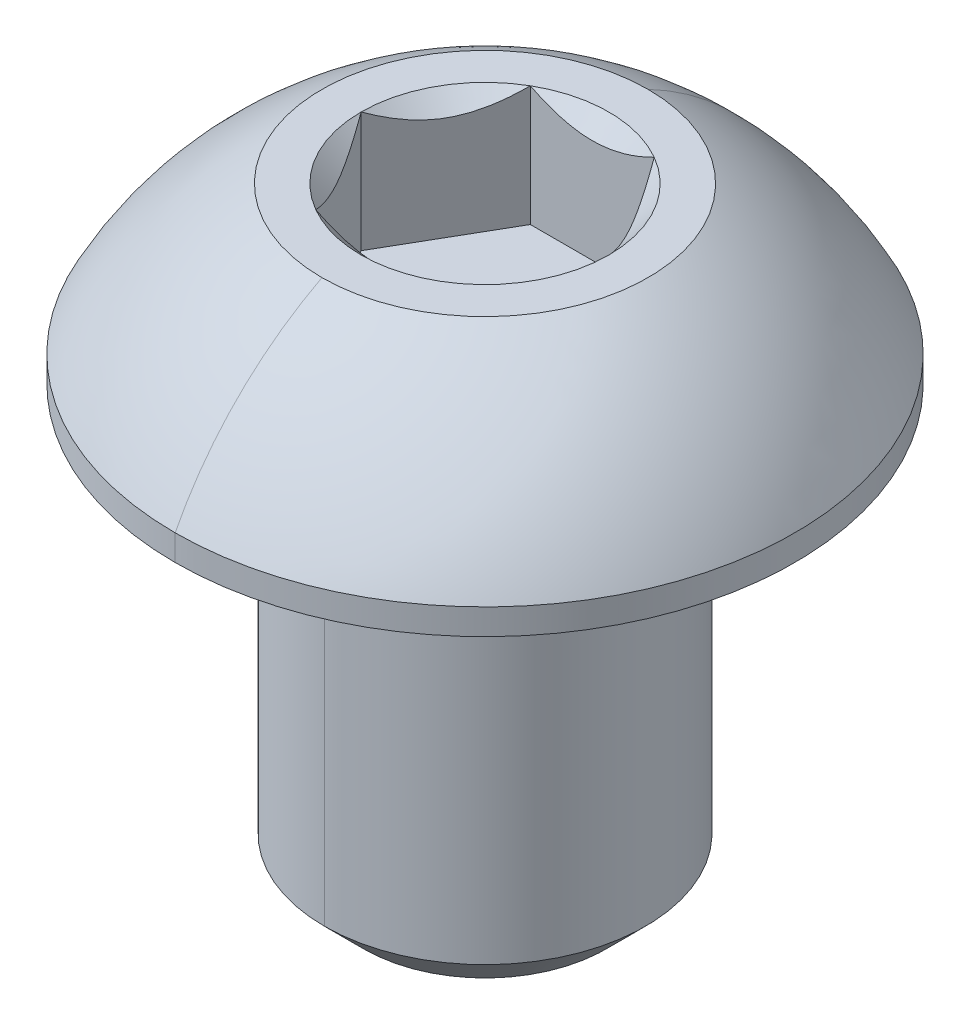
ISO-10303-21;
HEADER;
FILE_DESCRIPTION(('STEP AP214'),'2;1');
FILE_NAME('part.step','',(''),(''),'','','');
FILE_SCHEMA(('AUTOMOTIVE_DESIGN { 1 0 10303 214 1 1 1 1 }'));
ENDSEC;
DATA;
#1=APPLICATION_CONTEXT('core data for automotive mechanical design processes');
#2=APPLICATION_PROTOCOL_DEFINITION('international standard','automotive_design',2000,#1);
#3=PRODUCT_CONTEXT('',#1,'mechanical');
#4=PRODUCT('Part','Part','',(#3));
#5=PRODUCT_RELATED_PRODUCT_CATEGORY('part','',(#4));
#6=PRODUCT_DEFINITION_FORMATION('','',#4);
#7=PRODUCT_DEFINITION_CONTEXT('part definition',#1,'design');
#8=PRODUCT_DEFINITION('design','',#6,#7);
#9=PRODUCT_DEFINITION_SHAPE('','',#8);
#10=(LENGTH_UNIT() NAMED_UNIT(*) SI_UNIT(.MILLI.,.METRE.));
#11=(NAMED_UNIT(*) PLANE_ANGLE_UNIT() SI_UNIT($,.RADIAN.));
#12=(NAMED_UNIT(*) SI_UNIT($,.STERADIAN.) SOLID_ANGLE_UNIT());
#13=UNCERTAINTY_MEASURE_WITH_UNIT(LENGTH_MEASURE(1.E-05),#10,'distance_accuracy_value','');
#14=(GEOMETRIC_REPRESENTATION_CONTEXT(3) GLOBAL_UNCERTAINTY_ASSIGNED_CONTEXT((#13)) GLOBAL_UNIT_ASSIGNED_CONTEXT((#10,
#11,#12)) REPRESENTATION_CONTEXT('',''));
#15=CARTESIAN_POINT('',(0.,0.,0.));
#16=DIRECTION('',(0.,0.,1.));
#17=DIRECTION('',(1.,0.,0.));
#18=AXIS2_PLACEMENT_3D('',#15,#16,#17);
#19=CARTESIAN_POINT('',(0.,-0.1524,0.));
#20=DIRECTION('',(0.,1.,0.));
#21=DIRECTION('',(0.,0.,1.));
#22=AXIS2_PLACEMENT_3D('',#19,#20,#21);
#23=TOROIDAL_SURFACE('',#22,2.5273,0.1524);
#24=CARTESIAN_POINT('',(0.,-0.1524,-2.5273));
#25=DIRECTION('',(1.,0.,0.));
#26=DIRECTION('',(0.,0.,-1.));
#27=AXIS2_PLACEMENT_3D('',#24,#25,#26);
#28=CIRCLE('',#27,0.1524);
#29=CARTESIAN_POINT('',(0.,0.,-2.5273));
#30=VERTEX_POINT('',#29);
#31=CARTESIAN_POINT('',(0.,-0.1524,-2.3749));
#32=VERTEX_POINT('',#31);
#33=EDGE_CURVE('E225',#30,#32,#28,.T.);
#34=ORIENTED_EDGE('',*,*,#33,.F.);
#35=CARTESIAN_POINT('',(0.,0.,0.));
#36=DIRECTION('',(0.,1.,0.));
#37=DIRECTION('',(0.,0.,1.));
#38=AXIS2_PLACEMENT_3D('',#35,#36,#37);
#39=CIRCLE('',#38,2.5273);
#40=CARTESIAN_POINT('',(0.,0.,2.5273));
#41=VERTEX_POINT('',#40);
#42=EDGE_CURVE('E177',#41,#30,#39,.T.);
#43=ORIENTED_EDGE('',*,*,#42,.F.);
#44=CARTESIAN_POINT('',(0.,-0.1524,2.5273));
#45=DIRECTION('',(-1.,0.,0.));
#46=DIRECTION('',(0.,0.,1.));
#47=AXIS2_PLACEMENT_3D('',#44,#45,#46);
#48=CIRCLE('',#47,0.1524);
#49=CARTESIAN_POINT('',(0.,-0.1524,2.3749));
#50=VERTEX_POINT('',#49);
#51=EDGE_CURVE('E221',#41,#50,#48,.T.);
#52=ORIENTED_EDGE('',*,*,#51,.T.);
#53=CARTESIAN_POINT('',(0.,-0.1524,0.));
#54=DIRECTION('',(0.,-1.,0.));
#55=DIRECTION('',(0.,0.,1.));
#56=AXIS2_PLACEMENT_3D('',#53,#54,#55);
#57=CIRCLE('',#56,2.3749);
#58=EDGE_CURVE('E405',#32,#50,#57,.T.);
#59=ORIENTED_EDGE('',*,*,#58,.F.);
#60=EDGE_LOOP('',(#34,#43,#52,#59));
#61=FACE_BOUND('',#60,.T.);
#62=ADVANCED_FACE('F16',(#61),#23,.F.);
#63=CARTESIAN_POINT('',(0.,2.5654,0.));
#64=DIRECTION('',(0.,1.,0.));
#65=DIRECTION('',(0.,0.,1.));
#66=AXIS2_PLACEMENT_3D('',#63,#64,#65);
#67=CONICAL_SURFACE('',#66,1.83308710467706,0.78539816339745);
#68=DIRECTION('',(0.,0.707106781186546,-0.707106781186549));
#69=VECTOR('',#68,1.);
#70=CARTESIAN_POINT('',(0.,2.5654,-1.83308710467706));
#71=LINE('',#70,#69);
#72=CARTESIAN_POINT('',(0.,0.732312895322944,0.));
#73=VERTEX_POINT('',#72);
#74=CARTESIAN_POINT('',(0.,0.7874,-0.0550871046770556));
#75=VERTEX_POINT('',#74);
#76=EDGE_CURVE('E220',#73,#75,#71,.T.);
#77=ORIENTED_EDGE('',*,*,#76,.F.);
#78=DIRECTION('',(0.,0.707106781186546,0.707106781186549));
#79=VECTOR('',#78,1.);
#80=CARTESIAN_POINT('',(0.,2.5654,1.83308710467706));
#81=LINE('',#80,#79);
#82=CARTESIAN_POINT('',(0.,0.7874,0.0550871046770556));
#83=VERTEX_POINT('',#82);
#84=EDGE_CURVE('E216',#73,#83,#81,.T.);
#85=ORIENTED_EDGE('',*,*,#84,.T.);
#86=CARTESIAN_POINT('',(0.,0.7874,0.));
#87=DIRECTION('',(0.,1.,0.));
#88=DIRECTION('',(0.,0.,1.));
#89=AXIS2_PLACEMENT_3D('',#86,#87,#88);
#90=CIRCLE('',#89,0.0550871046770558);
#91=EDGE_CURVE('E202',#83,#75,#90,.T.);
#92=ORIENTED_EDGE('',*,*,#91,.T.);
#93=EDGE_LOOP('',(#77,#85,#92));
#94=FACE_BOUND('',#93,.T.);
#95=ADVANCED_FACE('F256',(#94),#67,.F.);
#96=CARTESIAN_POINT('',(1.83308710467706,0.7874,0.));
#97=DIRECTION('',(0.866025403784439,0.,-0.5));
#98=DIRECTION('',(0.,-1.,0.));
#99=AXIS2_PLACEMENT_3D('',#96,#97,#98);
#100=PLANE('',#99);
#101=DIRECTION('',(0.,1.,0.));
#102=VECTOR('',#101,1.);
#103=CARTESIAN_POINT('',(1.83308710467706,0.7874,0.));
#104=LINE('',#103,#102);
#105=CARTESIAN_POINT('',(1.83308710467706,0.7874,0.));
#106=VERTEX_POINT('',#105);
#107=CARTESIAN_POINT('',(1.83308710467706,2.5654,0.));
#108=VERTEX_POINT('',#107);
#109=EDGE_CURVE('E11',#106,#108,#104,.T.);
#110=ORIENTED_EDGE('',*,*,#109,.T.);
#111=CARTESIAN_POINT('',(1.83308710467706,2.5654,0.));
#112=CARTESIAN_POINT('',(1.58854939316106,2.32086228848399,-0.423551740712339));
#113=CARTESIAN_POINT('',(1.37650342717985,2.31981648546325,-0.790826127331817));
#114=CARTESIAN_POINT('',(1.16317917435944,2.31876437797812,-1.16031457170343));
#115=CARTESIAN_POINT('',(0.91654355233853,2.5654,-1.5875));
#116=B_SPLINE_CURVE_WITH_KNOTS('',2,(#111,#112,#113,#114,#115),.UNSPECIFIED.,.F.,.F.,(3,2,3),
(0.,0.5,1.),.UNSPECIFIED.);
#117=CARTESIAN_POINT('',(0.916543552338531,2.5654,-1.5875));
#118=VERTEX_POINT('',#117);
#119=EDGE_CURVE('E209',#108,#118,#116,.T.);
#120=ORIENTED_EDGE('',*,*,#119,.T.);
#121=DIRECTION('',(0.,1.,0.));
#122=VECTOR('',#121,1.);
#123=CARTESIAN_POINT('',(0.916543552338531,0.7874,-1.5875));
#124=LINE('',#123,#122);
#125=CARTESIAN_POINT('',(0.916543552338531,0.7874,-1.5875));
#126=VERTEX_POINT('',#125);
#127=EDGE_CURVE('E481',#126,#118,#124,.T.);
#128=ORIENTED_EDGE('',*,*,#127,.F.);
#129=DIRECTION('',(-0.5,0.,-0.866025403784439));
#130=VECTOR('',#129,1.);
#131=CARTESIAN_POINT('',(1.83308710467706,0.7874,0.));
#132=LINE('',#131,#130);
#133=EDGE_CURVE('E204',#106,#126,#132,.T.);
#134=ORIENTED_EDGE('',*,*,#133,.F.);
#135=EDGE_LOOP('',(#110,#120,#128,#134));
#136=FACE_BOUND('',#135,.T.);
#137=ADVANCED_FACE('F245',(#136),#100,.F.);
#138=CARTESIAN_POINT('',(0.916543552338531,0.7874,1.5875));
#139=DIRECTION('',(0.866025403784439,0.,0.5));
#140=DIRECTION('',(0.,-1.,0.));
#141=AXIS2_PLACEMENT_3D('',#138,#139,#140);
#142=PLANE('',#141);
#143=DIRECTION('',(0.,1.,0.));
#144=VECTOR('',#143,1.);
#145=CARTESIAN_POINT('',(0.916543552338531,0.7874,1.5875));
#146=LINE('',#145,#144);
#147=CARTESIAN_POINT('',(0.916543552338531,0.7874,1.5875));
#148=VERTEX_POINT('',#147);
#149=CARTESIAN_POINT('',(0.916543552338531,2.5654,1.5875));
#150=VERTEX_POINT('',#149);
#151=EDGE_CURVE('E29',#148,#150,#146,.T.);
#152=ORIENTED_EDGE('',*,*,#151,.T.);
#153=CARTESIAN_POINT('',(0.916543552338531,2.5654,1.5875));
#154=CARTESIAN_POINT('',(1.16108126385472,2.32086228848382,1.16394825928734));
#155=CARTESIAN_POINT('',(1.37312722983574,2.31981648546325,0.796673872668184));
#156=CARTESIAN_POINT('',(1.58645148265633,2.3187643779783,0.427185428296259));
#157=CARTESIAN_POINT('',(1.83308710467706,2.5654,0.));
#158=B_SPLINE_CURVE_WITH_KNOTS('',2,(#153,#154,#155,#156,#157),.UNSPECIFIED.,.F.,.F.,(3,2,3),
(0.,0.5,1.),.UNSPECIFIED.);
#159=EDGE_CURVE('E329',#150,#108,#158,.T.);
#160=ORIENTED_EDGE('',*,*,#159,.T.);
#161=ORIENTED_EDGE('',*,*,#109,.F.);
#162=DIRECTION('',(0.5,0.,-0.866025403784439));
#163=VECTOR('',#162,1.);
#164=CARTESIAN_POINT('',(0.916543552338531,0.7874,1.5875));
#165=LINE('',#164,#163);
#166=EDGE_CURVE('E415',#148,#106,#165,.T.);
#167=ORIENTED_EDGE('',*,*,#166,.F.);
#168=EDGE_LOOP('',(#152,#160,#161,#167));
#169=FACE_BOUND('',#168,.T.);
#170=ADVANCED_FACE('F255',(#169),#142,.F.);
#171=CARTESIAN_POINT('',(-0.91654355233853,0.7874,1.5875));
#172=DIRECTION('',(0.,0.,1.));
#173=DIRECTION('',(1.,0.,0.));
#174=AXIS2_PLACEMENT_3D('',#171,#172,#173);
#175=PLANE('',#174);
#176=DIRECTION('',(0.,1.,0.));
#177=VECTOR('',#176,1.);
#178=CARTESIAN_POINT('',(-0.91654355233853,0.7874,1.5875));
#179=LINE('',#178,#177);
#180=CARTESIAN_POINT('',(-0.91654355233853,0.7874,1.5875));
#181=VERTEX_POINT('',#180);
#182=CARTESIAN_POINT('',(-0.91654355233853,2.5654,1.5875));
#183=VERTEX_POINT('',#182);
#184=EDGE_CURVE('E341',#181,#183,#179,.T.);
#185=ORIENTED_EDGE('',*,*,#184,.T.);
#186=CARTESIAN_POINT('',(-0.916543552338531,2.5654,1.5875));
#187=CARTESIAN_POINT('',(-0.684381010738564,2.44931872920002,1.5875));
#188=CARTESIAN_POINT('',(-0.4718738638875,2.38845938444161,1.5875));
#189=CARTESIAN_POINT('',(-0.232175759974894,2.31981289532294,1.5875));
#190=CARTESIAN_POINT('',(0.,2.31981289532294,1.5875));
#191=B_SPLINE_CURVE_WITH_KNOTS('',2,(#186,#187,#188,#189,#190),.UNSPECIFIED.,.F.,.F.,(3,2,3),
(0.,0.5,1.),.UNSPECIFIED.);
#192=CARTESIAN_POINT('',(0.,2.31981289532294,1.5875));
#193=VERTEX_POINT('',#192);
#194=EDGE_CURVE('E353',#183,#193,#191,.T.);
#195=ORIENTED_EDGE('',*,*,#194,.T.);
#196=CARTESIAN_POINT('',(0.,2.31981289532294,1.5875));
#197=CARTESIAN_POINT('',(0.229732695645398,2.31981289532294,1.5875));
#198=CARTESIAN_POINT('',(0.471961624215038,2.3884843914945,1.5875));
#199=CARTESIAN_POINT('',(0.68154594324368,2.44790119545257,1.5875));
#200=CARTESIAN_POINT('',(0.91654355233853,2.5654,1.5875));
#201=B_SPLINE_CURVE_WITH_KNOTS('',2,(#196,#197,#198,#199,#200),.UNSPECIFIED.,.F.,.F.,(3,2,3),
(0.,0.5,1.),.UNSPECIFIED.);
#202=EDGE_CURVE('E383',#193,#150,#201,.T.);
#203=ORIENTED_EDGE('',*,*,#202,.T.);
#204=ORIENTED_EDGE('',*,*,#151,.F.);
#205=DIRECTION('',(1.,0.,0.));
#206=VECTOR('',#205,1.);
#207=CARTESIAN_POINT('',(-0.91654355233853,0.7874,1.5875));
#208=LINE('',#207,#206);
#209=EDGE_CURVE('E418',#181,#148,#208,.T.);
#210=ORIENTED_EDGE('',*,*,#209,.F.);
#211=EDGE_LOOP('',(#185,#195,#203,#204,#210));
#212=FACE_BOUND('',#211,.T.);
#213=ADVANCED_FACE('F264',(#212),#175,.F.);
#214=CARTESIAN_POINT('',(-1.83308710467706,0.7874,0.));
#215=DIRECTION('',(-0.866025403784439,0.,0.5));
#216=DIRECTION('',(0.,1.,0.));
#217=AXIS2_PLACEMENT_3D('',#214,#215,#216);
#218=PLANE('',#217);
#219=DIRECTION('',(0.,1.,0.));
#220=VECTOR('',#219,1.);
#221=CARTESIAN_POINT('',(-1.83308710467706,0.7874,0.));
#222=LINE('',#221,#220);
#223=CARTESIAN_POINT('',(-1.83308710467706,0.7874,0.));
#224=VERTEX_POINT('',#223);
#225=CARTESIAN_POINT('',(-1.83308710467706,2.5654,0.));
#226=VERTEX_POINT('',#225);
#227=EDGE_CURVE('E289',#224,#226,#222,.T.);
#228=ORIENTED_EDGE('',*,*,#227,.T.);
#229=CARTESIAN_POINT('',(-1.83308710467706,2.5654,0.));
#230=CARTESIAN_POINT('',(-1.58854939316106,2.32086228848399,0.423551740712331));
#231=CARTESIAN_POINT('',(-1.37650342717985,2.31981648546325,0.790826127331817));
#232=CARTESIAN_POINT('',(-1.16317917435944,2.31876437797812,1.16031457170343));
#233=CARTESIAN_POINT('',(-0.91654355233853,2.5654,1.5875));
#234=B_SPLINE_CURVE_WITH_KNOTS('',2,(#229,#230,#231,#232,#233),.UNSPECIFIED.,.F.,.F.,(3,2,3),
(0.,0.5,1.),.UNSPECIFIED.);
#235=EDGE_CURVE('E283',#226,#183,#234,.T.);
#236=ORIENTED_EDGE('',*,*,#235,.T.);
#237=ORIENTED_EDGE('',*,*,#184,.F.);
#238=DIRECTION('',(0.5,0.,0.866025403784438));
#239=VECTOR('',#238,1.);
#240=CARTESIAN_POINT('',(-1.83308710467706,0.7874,0.));
#241=LINE('',#240,#239);
#242=EDGE_CURVE('E464',#224,#181,#241,.T.);
#243=ORIENTED_EDGE('',*,*,#242,.F.);
#244=EDGE_LOOP('',(#228,#236,#237,#243));
#245=FACE_BOUND('',#244,.T.);
#246=ADVANCED_FACE('F259',(#245),#218,.F.);
#247=CARTESIAN_POINT('',(-0.916543552338531,0.7874,-1.5875));
#248=DIRECTION('',(-0.866025403784439,0.,-0.5));
#249=DIRECTION('',(-0.5,0.,0.866025403784439));
#250=AXIS2_PLACEMENT_3D('',#247,#248,#249);
#251=PLANE('',#250);
#252=DIRECTION('',(0.,1.,0.));
#253=VECTOR('',#252,1.);
#254=CARTESIAN_POINT('',(-0.916543552338531,0.7874,-1.5875));
#255=LINE('',#254,#253);
#256=CARTESIAN_POINT('',(-0.916543552338531,0.7874,-1.5875));
#257=VERTEX_POINT('',#256);
#258=CARTESIAN_POINT('',(-0.916543552338531,2.5654,-1.5875));
#259=VERTEX_POINT('',#258);
#260=EDGE_CURVE('E482',#257,#259,#255,.T.);
#261=ORIENTED_EDGE('',*,*,#260,.T.);
#262=CARTESIAN_POINT('',(-0.916543552338531,2.5654,-1.5875));
#263=CARTESIAN_POINT('',(-1.16108126385453,2.320862288484,-1.16394825928767));
#264=CARTESIAN_POINT('',(-1.37312722983574,2.31981648546325,-0.796673872668183));
#265=CARTESIAN_POINT('',(-1.58645148265615,2.31876437797813,-0.427185428296571));
#266=CARTESIAN_POINT('',(-1.83308710467706,2.5654,0.));
#267=B_SPLINE_CURVE_WITH_KNOTS('',2,(#262,#263,#264,#265,#266),.UNSPECIFIED.,.F.,.F.,(3,2,3),
(0.,0.5,1.),.UNSPECIFIED.);
#268=EDGE_CURVE('E491',#259,#226,#267,.T.);
#269=ORIENTED_EDGE('',*,*,#268,.T.);
#270=ORIENTED_EDGE('',*,*,#227,.F.);
#271=DIRECTION('',(-0.5,0.,0.866025403784439));
#272=VECTOR('',#271,1.);
#273=CARTESIAN_POINT('',(-0.916543552338531,0.7874,-1.5875));
#274=LINE('',#273,#272);
#275=EDGE_CURVE('E460',#257,#224,#274,.T.);
#276=ORIENTED_EDGE('',*,*,#275,.F.);
#277=EDGE_LOOP('',(#261,#269,#270,#276));
#278=FACE_BOUND('',#277,.T.);
#279=ADVANCED_FACE('F263',(#278),#251,.F.);
#280=CARTESIAN_POINT('',(0.916543552338531,0.7874,-1.5875));
#281=DIRECTION('',(0.,0.,-1.));
#282=DIRECTION('',(-1.,0.,0.));
#283=AXIS2_PLACEMENT_3D('',#280,#281,#282);
#284=PLANE('',#283);
#285=ORIENTED_EDGE('',*,*,#127,.T.);
#286=CARTESIAN_POINT('',(0.916543552338531,2.5654,-1.5875));
#287=CARTESIAN_POINT('',(0.68330023814449,2.44877834290298,-1.5875));
#288=CARTESIAN_POINT('',(0.472022049766507,2.38850161206546,-1.5875));
#289=CARTESIAN_POINT('',(0.231606862063275,2.31991222444484,-1.5875));
#290=CARTESIAN_POINT('',(0.000126990617285933,2.31981290040219,-1.5875));
#291=CARTESIAN_POINT('',(-0.230319895797069,2.3197140195957,-1.5875));
#292=CARTESIAN_POINT('',(-0.471813597713689,2.38844221424328,-1.5875));
#293=CARTESIAN_POINT('',(-0.682613944360854,2.44843519601116,-1.5875));
#294=CARTESIAN_POINT('',(-0.916543552338529,2.5654,-1.5875));
#295=B_SPLINE_CURVE_WITH_KNOTS('',2,(#286,#287,#288,#289,#290,#291,#292,#293,#294),
.UNSPECIFIED.,.F.,.F.,(3,2,2,2,3),(0.,0.25,0.5,0.75,1.),.UNSPECIFIED.);
#296=EDGE_CURVE('E483',#118,#259,#295,.T.);
#297=ORIENTED_EDGE('',*,*,#296,.T.);
#298=ORIENTED_EDGE('',*,*,#260,.F.);
#299=DIRECTION('',(-1.,0.,0.));
#300=VECTOR('',#299,1.);
#301=CARTESIAN_POINT('',(0.916543552338531,0.7874,-1.5875));
#302=LINE('',#301,#300);
#303=EDGE_CURVE('E208',#126,#257,#302,.T.);
#304=ORIENTED_EDGE('',*,*,#303,.F.);
#305=EDGE_LOOP('',(#285,#297,#298,#304));
#306=FACE_BOUND('',#305,.T.);
#307=ADVANCED_FACE('F479',(#306),#284,.F.);
#308=CARTESIAN_POINT('',(0.,0.7874,0.));
#309=DIRECTION('',(0.,1.,0.));
#310=DIRECTION('',(1.,0.,0.));
#311=AXIS2_PLACEMENT_3D('',#308,#309,#310);
#312=PLANE('',#311);
#313=ORIENTED_EDGE('',*,*,#91,.F.);
#314=CARTESIAN_POINT('',(0.,0.7874,0.));
#315=DIRECTION('',(0.,1.,0.));
#316=DIRECTION('',(0.,0.,1.));
#317=AXIS2_PLACEMENT_3D('',#314,#315,#316);
#318=CIRCLE('',#317,0.0550871046770558);
#319=EDGE_CURVE('E234',#75,#83,#318,.T.);
#320=ORIENTED_EDGE('',*,*,#319,.F.);
#321=EDGE_LOOP('',(#313,#320));
#322=FACE_BOUND('',#321,.T.);
#323=ORIENTED_EDGE('',*,*,#133,.T.);
#324=ORIENTED_EDGE('',*,*,#303,.T.);
#325=ORIENTED_EDGE('',*,*,#275,.T.);
#326=ORIENTED_EDGE('',*,*,#242,.T.);
#327=ORIENTED_EDGE('',*,*,#209,.T.);
#328=ORIENTED_EDGE('',*,*,#166,.T.);
#329=EDGE_LOOP('',(#323,#324,#325,#326,#327,#328));
#330=FACE_BOUND('',#329,.T.);
#331=ADVANCED_FACE('F257',(#322,#330),#312,.T.);
#332=CARTESIAN_POINT('',(0.,2.5654,0.));
#333=DIRECTION('',(0.,1.,0.));
#334=DIRECTION('',(0.,0.,1.));
#335=AXIS2_PLACEMENT_3D('',#332,#333,#334);
#336=CONICAL_SURFACE('',#335,1.83308710467706,0.78539816339745);
#337=CARTESIAN_POINT('',(0.,2.5654,0.));
#338=DIRECTION('',(0.,1.,0.));
#339=DIRECTION('',(0.,0.,1.));
#340=AXIS2_PLACEMENT_3D('',#337,#338,#339);
#341=CIRCLE('',#340,1.83308710467706);
#342=EDGE_CURVE('E1042',#108,#118,#341,.T.);
#343=ORIENTED_EDGE('',*,*,#342,.T.);
#344=ORIENTED_EDGE('',*,*,#119,.F.);
#345=EDGE_LOOP('',(#343,#344));
#346=FACE_BOUND('',#345,.T.);
#347=ADVANCED_FACE('F678',(#346),#336,.F.);
#348=CARTESIAN_POINT('',(0.,2.5654,0.));
#349=DIRECTION('',(0.,1.,0.));
#350=DIRECTION('',(0.,0.,1.));
#351=AXIS2_PLACEMENT_3D('',#348,#349,#350);
#352=CONICAL_SURFACE('',#351,1.83308710467706,0.78539816339745);
#353=CARTESIAN_POINT('',(0.,2.5654,0.));
#354=DIRECTION('',(0.,1.,0.));
#355=DIRECTION('',(0.,0.,1.));
#356=AXIS2_PLACEMENT_3D('',#353,#354,#355);
#357=CIRCLE('',#356,1.83308710467706);
#358=EDGE_CURVE('E1038',#150,#108,#357,.T.);
#359=ORIENTED_EDGE('',*,*,#358,.T.);
#360=ORIENTED_EDGE('',*,*,#159,.F.);
#361=EDGE_LOOP('',(#359,#360));
#362=FACE_BOUND('',#361,.T.);
#363=ADVANCED_FACE('F303',(#362),#352,.F.);
#364=CARTESIAN_POINT('',(0.,2.5654,0.));
#365=DIRECTION('',(0.,1.,0.));
#366=DIRECTION('',(0.,0.,1.));
#367=AXIS2_PLACEMENT_3D('',#364,#365,#366);
#368=CONICAL_SURFACE('',#367,1.83308710467706,0.78539816339745);
#369=DIRECTION('',(0.,0.707106781186546,0.707106781186549));
#370=VECTOR('',#369,1.);
#371=CARTESIAN_POINT('',(0.,2.5654,1.83308710467706));
#372=LINE('',#371,#370);
#373=CARTESIAN_POINT('',(0.,2.5654,1.83308710467706));
#374=VERTEX_POINT('',#373);
#375=EDGE_CURVE('E347',#193,#374,#372,.T.);
#376=ORIENTED_EDGE('',*,*,#375,.F.);
#377=ORIENTED_EDGE('',*,*,#194,.F.);
#378=CARTESIAN_POINT('',(0.,2.5654,0.));
#379=DIRECTION('',(0.,1.,0.));
#380=DIRECTION('',(0.,0.,1.));
#381=AXIS2_PLACEMENT_3D('',#378,#379,#380);
#382=CIRCLE('',#381,1.83308710467706);
#383=EDGE_CURVE('E575',#183,#374,#382,.T.);
#384=ORIENTED_EDGE('',*,*,#383,.T.);
#385=EDGE_LOOP('',(#376,#377,#384));
#386=FACE_BOUND('',#385,.T.);
#387=ADVANCED_FACE('F302',(#386),#368,.F.);
#388=CARTESIAN_POINT('',(0.,2.5654,0.));
#389=DIRECTION('',(0.,1.,0.));
#390=DIRECTION('',(0.,0.,1.));
#391=AXIS2_PLACEMENT_3D('',#388,#389,#390);
#392=CONICAL_SURFACE('',#391,1.83308710467706,0.78539816339745);
#393=CARTESIAN_POINT('',(0.,2.5654,0.));
#394=DIRECTION('',(0.,1.,0.));
#395=DIRECTION('',(0.,0.,1.));
#396=AXIS2_PLACEMENT_3D('',#393,#394,#395);
#397=CIRCLE('',#396,1.83308710467706);
#398=EDGE_CURVE('E568',#226,#183,#397,.T.);
#399=ORIENTED_EDGE('',*,*,#398,.T.);
#400=ORIENTED_EDGE('',*,*,#235,.F.);
#401=EDGE_LOOP('',(#399,#400));
#402=FACE_BOUND('',#401,.T.);
#403=ADVANCED_FACE('F291',(#402),#392,.F.);
#404=CARTESIAN_POINT('',(0.,2.5654,0.));
#405=DIRECTION('',(0.,1.,0.));
#406=DIRECTION('',(0.,0.,1.));
#407=AXIS2_PLACEMENT_3D('',#404,#405,#406);
#408=CONICAL_SURFACE('',#407,1.83308710467706,0.78539816339745);
#409=CARTESIAN_POINT('',(0.,2.5654,0.));
#410=DIRECTION('',(0.,1.,0.));
#411=DIRECTION('',(0.,0.,1.));
#412=AXIS2_PLACEMENT_3D('',#409,#410,#411);
#413=CIRCLE('',#412,1.83308710467706);
#414=EDGE_CURVE('E555',#259,#226,#413,.T.);
#415=ORIENTED_EDGE('',*,*,#414,.T.);
#416=ORIENTED_EDGE('',*,*,#268,.F.);
#417=EDGE_LOOP('',(#415,#416));
#418=FACE_BOUND('',#417,.T.);
#419=ADVANCED_FACE('F301',(#418),#408,.F.);
#420=CARTESIAN_POINT('',(0.,2.5654,0.));
#421=DIRECTION('',(0.,1.,0.));
#422=DIRECTION('',(0.,0.,1.));
#423=AXIS2_PLACEMENT_3D('',#420,#421,#422);
#424=CONICAL_SURFACE('',#423,1.83308710467706,0.78539816339745);
#425=CARTESIAN_POINT('',(0.,2.5654,0.));
#426=DIRECTION('',(0.,1.,0.));
#427=DIRECTION('',(0.,0.,1.));
#428=AXIS2_PLACEMENT_3D('',#425,#426,#427);
#429=CIRCLE('',#428,1.83308710467706);
#430=EDGE_CURVE('E404',#118,#259,#429,.T.);
#431=ORIENTED_EDGE('',*,*,#430,.T.);
#432=ORIENTED_EDGE('',*,*,#296,.F.);
#433=EDGE_LOOP('',(#431,#432));
#434=FACE_BOUND('',#433,.T.);
#435=ADVANCED_FACE('F310',(#434),#424,.F.);
#436=CARTESIAN_POINT('',(0.,2.5654,-2.413));
#437=DIRECTION('',(0.,-1.,0.));
#438=DIRECTION('',(0.,0.,-1.));
#439=AXIS2_PLACEMENT_3D('',#436,#437,#438);
#440=PLANE('',#439);
#441=ORIENTED_EDGE('',*,*,#430,.F.);
#442=ORIENTED_EDGE('',*,*,#342,.F.);
#443=ORIENTED_EDGE('',*,*,#358,.F.);
#444=CARTESIAN_POINT('',(0.,2.5654,0.));
#445=DIRECTION('',(0.,1.,0.));
#446=DIRECTION('',(0.,0.,1.));
#447=AXIS2_PLACEMENT_3D('',#444,#445,#446);
#448=CIRCLE('',#447,1.83308710467706);
#449=EDGE_CURVE('E215',#374,#150,#448,.T.);
#450=ORIENTED_EDGE('',*,*,#449,.F.);
#451=ORIENTED_EDGE('',*,*,#383,.F.);
#452=ORIENTED_EDGE('',*,*,#398,.F.);
#453=ORIENTED_EDGE('',*,*,#414,.F.);
#454=EDGE_LOOP('',(#441,#442,#443,#450,#451,#452,#453));
#455=FACE_BOUND('',#454,.T.);
#456=CARTESIAN_POINT('',(0.,2.5654,0.));
#457=DIRECTION('',(0.,1.,0.));
#458=DIRECTION('',(0.,0.,1.));
#459=AXIS2_PLACEMENT_3D('',#456,#457,#458);
#460=CIRCLE('',#459,2.413);
#461=CARTESIAN_POINT('',(0.,2.5654,2.413));
#462=VERTEX_POINT('',#461);
#463=CARTESIAN_POINT('',(0.,2.5654,-2.413));
#464=VERTEX_POINT('',#463);
#465=EDGE_CURVE('E198',#462,#464,#460,.T.);
#466=ORIENTED_EDGE('',*,*,#465,.T.);
#467=CARTESIAN_POINT('',(0.,2.5654,0.));
#468=DIRECTION('',(0.,1.,0.));
#469=DIRECTION('',(0.,0.,1.));
#470=AXIS2_PLACEMENT_3D('',#467,#468,#469);
#471=CIRCLE('',#470,2.413);
#472=EDGE_CURVE('E401',#464,#462,#471,.T.);
#473=ORIENTED_EDGE('',*,*,#472,.T.);
#474=EDGE_LOOP('',(#466,#473));
#475=FACE_BOUND('',#474,.T.);
#476=ADVANCED_FACE('F18',(#455,#475),#440,.F.);
#477=CARTESIAN_POINT('',(0.,-1.9398474797777,0.));
#478=DIRECTION('',(0.,1.,0.));
#479=DIRECTION('',(0.,0.,1.));
#480=AXIS2_PLACEMENT_3D('',#477,#478,#479);
#481=DEGENERATE_TOROIDAL_SURFACE('',#480,0.065843178235288,5.08,.T.);
#482=CARTESIAN_POINT('',(0.,-1.9398474797777,-0.065843178235288));
#483=DIRECTION('',(1.,0.,0.));
#484=DIRECTION('',(0.,0.,-1.));
#485=AXIS2_PLACEMENT_3D('',#482,#483,#484);
#486=CIRCLE('',#485,5.08);
#487=CARTESIAN_POINT('',(0.,0.381,-4.5847));
#488=VERTEX_POINT('',#487);
#489=EDGE_CURVE('E214',#488,#464,#486,.T.);
#490=ORIENTED_EDGE('',*,*,#489,.F.);
#491=CARTESIAN_POINT('',(0.,0.381,0.));
#492=DIRECTION('',(0.,1.,0.));
#493=DIRECTION('',(0.,0.,1.));
#494=AXIS2_PLACEMENT_3D('',#491,#492,#493);
#495=CIRCLE('',#494,4.5847);
#496=CARTESIAN_POINT('',(0.,0.381,4.5847));
#497=VERTEX_POINT('',#496);
#498=EDGE_CURVE('E182',#488,#497,#495,.T.);
#499=ORIENTED_EDGE('',*,*,#498,.T.);
#500=CARTESIAN_POINT('',(0.,-1.9398474797777,0.065843178235288));
#501=DIRECTION('',(-1.,0.,0.));
#502=DIRECTION('',(0.,0.,1.));
#503=AXIS2_PLACEMENT_3D('',#500,#501,#502);
#504=CIRCLE('',#503,5.08);
#505=EDGE_CURVE('E191',#497,#462,#504,.T.);
#506=ORIENTED_EDGE('',*,*,#505,.T.);
#507=ORIENTED_EDGE('',*,*,#472,.F.);
#508=EDGE_LOOP('',(#490,#499,#506,#507));
#509=FACE_BOUND('',#508,.T.);
#510=ADVANCED_FACE('F733',(#509),#481,.T.);
#511=CARTESIAN_POINT('',(0.,2.5654,0.));
#512=DIRECTION('',(0.,1.,0.));
#513=DIRECTION('',(0.,0.,1.));
#514=AXIS2_PLACEMENT_3D('',#511,#512,#513);
#515=CYLINDRICAL_SURFACE('',#514,4.5847);
#516=DIRECTION('',(0.,1.,0.));
#517=VECTOR('',#516,1.);
#518=CARTESIAN_POINT('',(0.,2.5654,-4.5847));
#519=LINE('',#518,#517);
#520=CARTESIAN_POINT('',(0.,0.,-4.5847));
#521=VERTEX_POINT('',#520);
#522=EDGE_CURVE('E180',#521,#488,#519,.T.);
#523=ORIENTED_EDGE('',*,*,#522,.F.);
#524=CARTESIAN_POINT('',(0.,0.,0.));
#525=DIRECTION('',(0.,1.,0.));
#526=DIRECTION('',(0.,0.,1.));
#527=AXIS2_PLACEMENT_3D('',#524,#525,#526);
#528=CIRCLE('',#527,4.5847);
#529=CARTESIAN_POINT('',(0.,0.,4.5847));
#530=VERTEX_POINT('',#529);
#531=EDGE_CURVE('E166',#521,#530,#528,.T.);
#532=ORIENTED_EDGE('',*,*,#531,.T.);
#533=DIRECTION('',(0.,1.,0.));
#534=VECTOR('',#533,1.);
#535=CARTESIAN_POINT('',(0.,2.5654,4.5847));
#536=LINE('',#535,#534);
#537=EDGE_CURVE('E187',#530,#497,#536,.T.);
#538=ORIENTED_EDGE('',*,*,#537,.T.);
#539=ORIENTED_EDGE('',*,*,#498,.F.);
#540=EDGE_LOOP('',(#523,#532,#538,#539));
#541=FACE_BOUND('',#540,.T.);
#542=ADVANCED_FACE('F181',(#541),#515,.T.);
#543=CARTESIAN_POINT('',(0.,0.,0.));
#544=DIRECTION('',(0.,1.,0.));
#545=DIRECTION('',(1.,0.,0.));
#546=AXIS2_PLACEMENT_3D('',#543,#544,#545);
#547=PLANE('',#546);
#548=ORIENTED_EDGE('',*,*,#42,.T.);
#549=CARTESIAN_POINT('',(0.,0.,0.));
#550=DIRECTION('',(0.,1.,0.));
#551=DIRECTION('',(0.,0.,1.));
#552=AXIS2_PLACEMENT_3D('',#549,#550,#551);
#553=CIRCLE('',#552,2.5273);
#554=EDGE_CURVE('E230',#30,#41,#553,.T.);
#555=ORIENTED_EDGE('',*,*,#554,.T.);
#556=EDGE_LOOP('',(#548,#555));
#557=FACE_BOUND('',#556,.T.);
#558=CARTESIAN_POINT('',(0.,0.,0.));
#559=DIRECTION('',(0.,1.,0.));
#560=DIRECTION('',(0.,0.,1.));
#561=AXIS2_PLACEMENT_3D('',#558,#559,#560);
#562=CIRCLE('',#561,4.5847);
#563=EDGE_CURVE('E175',#530,#521,#562,.T.);
#564=ORIENTED_EDGE('',*,*,#563,.F.);
#565=ORIENTED_EDGE('',*,*,#531,.F.);
#566=EDGE_LOOP('',(#564,#565));
#567=FACE_BOUND('',#566,.T.);
#568=ADVANCED_FACE('F173',(#557,#567),#547,.F.);
#569=CARTESIAN_POINT('',(0.,-5.7658,0.));
#570=DIRECTION('',(0.,1.,0.));
#571=DIRECTION('',(0.,0.,1.));
#572=AXIS2_PLACEMENT_3D('',#569,#570,#571);
#573=CONICAL_SURFACE('',#572,2.3749,0.785398163397449);
#574=DIRECTION('',(0.,0.707106781186547,-0.707106781186548));
#575=VECTOR('',#574,1.);
#576=CARTESIAN_POINT('',(0.,-5.7658,-2.3749));
#577=LINE('',#576,#575);
#578=CARTESIAN_POINT('',(0.,-6.35,-1.7907));
#579=VERTEX_POINT('',#578);
#580=CARTESIAN_POINT('',(0.,-5.7658,-2.3749));
#581=VERTEX_POINT('',#580);
#582=EDGE_CURVE('E443',#579,#581,#577,.T.);
#583=ORIENTED_EDGE('',*,*,#582,.F.);
#584=CARTESIAN_POINT('',(0.,-6.35,0.));
#585=DIRECTION('',(0.,-1.,0.));
#586=DIRECTION('',(0.,0.,1.));
#587=AXIS2_PLACEMENT_3D('',#584,#585,#586);
#588=CIRCLE('',#587,1.7907);
#589=CARTESIAN_POINT('',(0.,-6.35,1.7907));
#590=VERTEX_POINT('',#589);
#591=EDGE_CURVE('E117',#590,#579,#588,.T.);
#592=ORIENTED_EDGE('',*,*,#591,.F.);
#593=DIRECTION('',(0.,0.707106781186547,0.707106781186548));
#594=VECTOR('',#593,1.);
#595=CARTESIAN_POINT('',(0.,-5.7658,2.3749));
#596=LINE('',#595,#594);
#597=CARTESIAN_POINT('',(0.,-5.7658,2.3749));
#598=VERTEX_POINT('',#597);
#599=EDGE_CURVE('E413',#590,#598,#596,.T.);
#600=ORIENTED_EDGE('',*,*,#599,.T.);
#601=CARTESIAN_POINT('',(0.,-5.7658,0.));
#602=DIRECTION('',(0.,1.,0.));
#603=DIRECTION('',(0.,0.,1.));
#604=AXIS2_PLACEMENT_3D('',#601,#602,#603);
#605=CIRCLE('',#604,2.3749);
#606=EDGE_CURVE('E103',#581,#598,#605,.T.);
#607=ORIENTED_EDGE('',*,*,#606,.F.);
#608=EDGE_LOOP('',(#583,#592,#600,#607));
#609=FACE_BOUND('',#608,.T.);
#610=ADVANCED_FACE('F721',(#609),#573,.T.);
#611=CARTESIAN_POINT('',(0.,-6.35,0.));
#612=DIRECTION('',(0.,1.,0.));
#613=DIRECTION('',(1.,0.,0.));
#614=AXIS2_PLACEMENT_3D('',#611,#612,#613);
#615=PLANE('',#614);
#616=ORIENTED_EDGE('',*,*,#591,.T.);
#617=CARTESIAN_POINT('',(0.,-6.35,0.));
#618=DIRECTION('',(0.,-1.,0.));
#619=DIRECTION('',(0.,0.,1.));
#620=AXIS2_PLACEMENT_3D('',#617,#618,#619);
#621=CIRCLE('',#620,1.7907);
#622=EDGE_CURVE('E224',#579,#590,#621,.T.);
#623=ORIENTED_EDGE('',*,*,#622,.T.);
#624=EDGE_LOOP('',(#616,#623));
#625=FACE_BOUND('',#624,.T.);
#626=ADVANCED_FACE('F659',(#625),#615,.F.);
#627=CARTESIAN_POINT('',(0.,-6.35,0.));
#628=DIRECTION('',(0.,1.,0.));
#629=DIRECTION('',(0.,0.,1.));
#630=AXIS2_PLACEMENT_3D('',#627,#628,#629);
#631=CYLINDRICAL_SURFACE('',#630,2.3749);
#632=DIRECTION('',(0.,1.,0.));
#633=VECTOR('',#632,1.);
#634=CARTESIAN_POINT('',(0.,-6.35,-2.3749));
#635=LINE('',#634,#633);
#636=EDGE_CURVE('E410',#581,#32,#635,.T.);
#637=ORIENTED_EDGE('',*,*,#636,.F.);
#638=ORIENTED_EDGE('',*,*,#606,.T.);
#639=DIRECTION('',(0.,1.,0.));
#640=VECTOR('',#639,1.);
#641=CARTESIAN_POINT('',(0.,-6.35,2.3749));
#642=LINE('',#641,#640);
#643=EDGE_CURVE('E409',#598,#50,#642,.T.);
#644=ORIENTED_EDGE('',*,*,#643,.T.);
#645=CARTESIAN_POINT('',(0.,-0.1524,0.));
#646=DIRECTION('',(0.,-1.,0.));
#647=DIRECTION('',(0.,0.,1.));
#648=AXIS2_PLACEMENT_3D('',#645,#646,#647);
#649=CIRCLE('',#648,2.3749);
#650=EDGE_CURVE('E229',#50,#32,#649,.T.);
#651=ORIENTED_EDGE('',*,*,#650,.T.);
#652=EDGE_LOOP('',(#637,#638,#644,#651));
#653=FACE_BOUND('',#652,.T.);
#654=ADVANCED_FACE('F367',(#653),#631,.T.);
#655=CARTESIAN_POINT('',(0.,-6.35,0.));
#656=DIRECTION('',(0.,1.,0.));
#657=DIRECTION('',(0.,0.,1.));
#658=AXIS2_PLACEMENT_3D('',#655,#656,#657);
#659=CYLINDRICAL_SURFACE('',#658,2.3749);
#660=CARTESIAN_POINT('',(0.,-5.7658,0.));
#661=DIRECTION('',(0.,1.,0.));
#662=DIRECTION('',(0.,0.,1.));
#663=AXIS2_PLACEMENT_3D('',#660,#661,#662);
#664=CIRCLE('',#663,2.3749);
#665=EDGE_CURVE('E437',#598,#581,#664,.T.);
#666=ORIENTED_EDGE('',*,*,#665,.T.);
#667=ORIENTED_EDGE('',*,*,#636,.T.);
#668=ORIENTED_EDGE('',*,*,#58,.T.);
#669=ORIENTED_EDGE('',*,*,#643,.F.);
#670=EDGE_LOOP('',(#666,#667,#668,#669));
#671=FACE_BOUND('',#670,.T.);
#672=ADVANCED_FACE('F647',(#671),#659,.T.);
#673=CARTESIAN_POINT('',(0.,-5.7658,0.));
#674=DIRECTION('',(0.,1.,0.));
#675=DIRECTION('',(0.,0.,1.));
#676=AXIS2_PLACEMENT_3D('',#673,#674,#675);
#677=CONICAL_SURFACE('',#676,2.3749,0.785398163397449);
#678=ORIENTED_EDGE('',*,*,#622,.F.);
#679=ORIENTED_EDGE('',*,*,#582,.T.);
#680=ORIENTED_EDGE('',*,*,#665,.F.);
#681=ORIENTED_EDGE('',*,*,#599,.F.);
#682=EDGE_LOOP('',(#678,#679,#680,#681));
#683=FACE_BOUND('',#682,.T.);
#684=ADVANCED_FACE('F642',(#683),#677,.T.);
#685=CARTESIAN_POINT('',(0.,2.5654,0.));
#686=DIRECTION('',(0.,1.,0.));
#687=DIRECTION('',(0.,0.,1.));
#688=AXIS2_PLACEMENT_3D('',#685,#686,#687);
#689=CYLINDRICAL_SURFACE('',#688,4.5847);
#690=ORIENTED_EDGE('',*,*,#563,.T.);
#691=ORIENTED_EDGE('',*,*,#522,.T.);
#692=CARTESIAN_POINT('',(0.,0.381,0.));
#693=DIRECTION('',(0.,1.,0.));
#694=DIRECTION('',(0.,0.,1.));
#695=AXIS2_PLACEMENT_3D('',#692,#693,#694);
#696=CIRCLE('',#695,4.5847);
#697=EDGE_CURVE('E210',#497,#488,#696,.T.);
#698=ORIENTED_EDGE('',*,*,#697,.F.);
#699=ORIENTED_EDGE('',*,*,#537,.F.);
#700=EDGE_LOOP('',(#690,#691,#698,#699));
#701=FACE_BOUND('',#700,.T.);
#702=ADVANCED_FACE('F189',(#701),#689,.T.);
#703=CARTESIAN_POINT('',(0.,-1.9398474797777,0.));
#704=DIRECTION('',(0.,1.,0.));
#705=DIRECTION('',(0.,0.,1.));
#706=AXIS2_PLACEMENT_3D('',#703,#704,#705);
#707=DEGENERATE_TOROIDAL_SURFACE('',#706,0.065843178235288,5.08,.T.);
#708=ORIENTED_EDGE('',*,*,#697,.T.);
#709=ORIENTED_EDGE('',*,*,#489,.T.);
#710=ORIENTED_EDGE('',*,*,#465,.F.);
#711=ORIENTED_EDGE('',*,*,#505,.F.);
#712=EDGE_LOOP('',(#708,#709,#710,#711));
#713=FACE_BOUND('',#712,.T.);
#714=ADVANCED_FACE('F803',(#713),#707,.T.);
#715=CARTESIAN_POINT('',(0.,2.5654,0.));
#716=DIRECTION('',(0.,1.,0.));
#717=DIRECTION('',(0.,0.,1.));
#718=AXIS2_PLACEMENT_3D('',#715,#716,#717);
#719=CONICAL_SURFACE('',#718,1.83308710467706,0.78539816339745);
#720=ORIENTED_EDGE('',*,*,#202,.F.);
#721=ORIENTED_EDGE('',*,*,#375,.T.);
#722=ORIENTED_EDGE('',*,*,#449,.T.);
#723=EDGE_LOOP('',(#720,#721,#722));
#724=FACE_BOUND('',#723,.T.);
#725=ADVANCED_FACE('F384',(#724),#719,.F.);
#726=CARTESIAN_POINT('',(0.,2.5654,0.));
#727=DIRECTION('',(0.,1.,0.));
#728=DIRECTION('',(0.,0.,1.));
#729=AXIS2_PLACEMENT_3D('',#726,#727,#728);
#730=CONICAL_SURFACE('',#729,1.83308710467706,0.78539816339745);
#731=ORIENTED_EDGE('',*,*,#84,.F.);
#732=ORIENTED_EDGE('',*,*,#76,.T.);
#733=ORIENTED_EDGE('',*,*,#319,.T.);
#734=EDGE_LOOP('',(#731,#732,#733));
#735=FACE_BOUND('',#734,.T.);
#736=ADVANCED_FACE('F802',(#735),#730,.F.);
#737=CARTESIAN_POINT('',(0.,-0.1524,0.));
#738=DIRECTION('',(0.,1.,0.));
#739=DIRECTION('',(0.,0.,1.));
#740=AXIS2_PLACEMENT_3D('',#737,#738,#739);
#741=TOROIDAL_SURFACE('',#740,2.5273,0.1524);
#742=ORIENTED_EDGE('',*,*,#554,.F.);
#743=ORIENTED_EDGE('',*,*,#33,.T.);
#744=ORIENTED_EDGE('',*,*,#650,.F.);
#745=ORIENTED_EDGE('',*,*,#51,.F.);
#746=EDGE_LOOP('',(#742,#743,#744,#745));
#747=FACE_BOUND('',#746,.T.);
#748=ADVANCED_FACE('F822',(#747),#741,.F.);
#749=CLOSED_SHELL('',(#62,#95,#137,#170,#213,#246,#279,#307,#331,#347,#363,#387,#403,#419,#435,
#476,#510,#542,#568,#610,#626,#654,#672,#684,#702,#714,#725,#736,#748));
#750=MANIFOLD_SOLID_BREP('B1',#749);
#751=ADVANCED_BREP_SHAPE_REPRESENTATION('',(#18,#750),#14);
#752=SHAPE_DEFINITION_REPRESENTATION(#9,#751);
ENDSEC;
END-ISO-10303-21;
